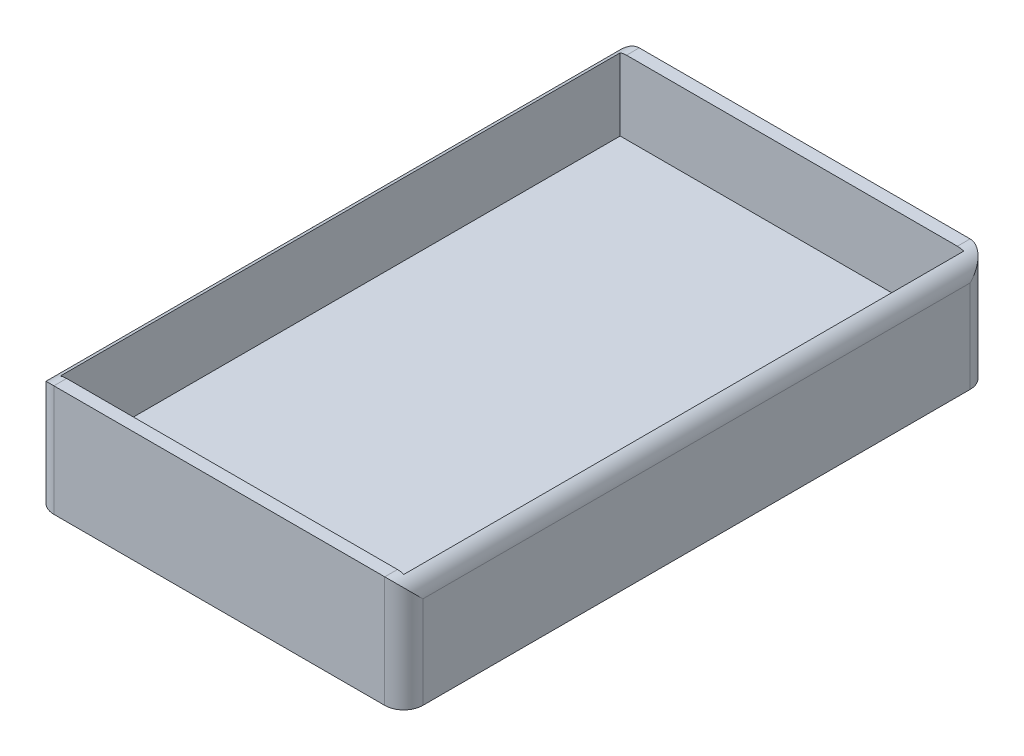
ISO-10303-21;
HEADER;
FILE_DESCRIPTION(('STEP AP214'),'2;1');
FILE_NAME('part.step','',(''),(''),'','','');
FILE_SCHEMA(('AUTOMOTIVE_DESIGN { 1 0 10303 214 1 1 1 1 }'));
ENDSEC;
DATA;
#1=APPLICATION_CONTEXT('core data for automotive mechanical design processes');
#2=APPLICATION_PROTOCOL_DEFINITION('international standard','automotive_design',2000,#1);
#3=PRODUCT_CONTEXT('',#1,'mechanical');
#4=PRODUCT('Part','Part','',(#3));
#5=PRODUCT_RELATED_PRODUCT_CATEGORY('part','',(#4));
#6=PRODUCT_DEFINITION_FORMATION('','',#4);
#7=PRODUCT_DEFINITION_CONTEXT('part definition',#1,'design');
#8=PRODUCT_DEFINITION('design','',#6,#7);
#9=PRODUCT_DEFINITION_SHAPE('','',#8);
#10=(LENGTH_UNIT() NAMED_UNIT(*) SI_UNIT(.MILLI.,.METRE.));
#11=(NAMED_UNIT(*) PLANE_ANGLE_UNIT() SI_UNIT($,.RADIAN.));
#12=(NAMED_UNIT(*) SI_UNIT($,.STERADIAN.) SOLID_ANGLE_UNIT());
#13=UNCERTAINTY_MEASURE_WITH_UNIT(LENGTH_MEASURE(1.E-05),#10,'distance_accuracy_value','');
#14=(GEOMETRIC_REPRESENTATION_CONTEXT(3) GLOBAL_UNCERTAINTY_ASSIGNED_CONTEXT((#13)) GLOBAL_UNIT_ASSIGNED_CONTEXT((#10,
#11,#12)) REPRESENTATION_CONTEXT('',''));
#15=CARTESIAN_POINT('',(0.,0.,0.));
#16=DIRECTION('',(0.,0.,1.));
#17=DIRECTION('',(1.,0.,0.));
#18=AXIS2_PLACEMENT_3D('',#15,#16,#17);
#19=CARTESIAN_POINT('',(0.,17.5,0.));
#20=DIRECTION('',(0.,-1.,0.));
#21=DIRECTION('',(0.,0.,-1.));
#22=AXIS2_PLACEMENT_3D('',#19,#20,#21);
#23=PLANE('',#22);
#24=DIRECTION('',(1.,0.,0.));
#25=VECTOR('',#24,1.);
#26=CARTESIAN_POINT('',(-29.,17.5,46.));
#27=LINE('',#26,#25);
#28=CARTESIAN_POINT('',(-26.,17.5,46.));
#29=VERTEX_POINT('',#28);
#30=CARTESIAN_POINT('',(26.,17.5,46.));
#31=VERTEX_POINT('',#30);
#32=EDGE_CURVE('E181',#29,#31,#27,.T.);
#33=ORIENTED_EDGE('',*,*,#32,.T.);
#34=DIRECTION('',(0.,0.,-1.));
#35=VECTOR('',#34,1.);
#36=CARTESIAN_POINT('',(26.,17.5,0.));
#37=LINE('',#36,#35);
#38=CARTESIAN_POINT('',(26.,17.5,44.));
#39=VERTEX_POINT('',#38);
#40=EDGE_CURVE('E219',#31,#39,#37,.T.);
#41=ORIENTED_EDGE('',*,*,#40,.T.);
#42=DIRECTION('',(1.,0.,0.));
#43=VECTOR('',#42,1.);
#44=CARTESIAN_POINT('',(-27.,17.5,44.));
#45=LINE('',#44,#43);
#46=CARTESIAN_POINT('',(-26.,17.5,44.));
#47=VERTEX_POINT('',#46);
#48=EDGE_CURVE('E160',#47,#39,#45,.T.);
#49=ORIENTED_EDGE('',*,*,#48,.F.);
#50=DIRECTION('',(0.,0.,1.));
#51=VECTOR('',#50,1.);
#52=CARTESIAN_POINT('',(-26.,17.5,0.));
#53=LINE('',#52,#51);
#54=EDGE_CURVE('E213',#47,#29,#53,.T.);
#55=ORIENTED_EDGE('',*,*,#54,.T.);
#56=EDGE_LOOP('',(#33,#41,#49,#55));
#57=FACE_BOUND('',#56,.T.);
#58=ADVANCED_FACE('F32',(#57),#23,.F.);
#59=CARTESIAN_POINT('',(29.,17.5,46.));
#60=DIRECTION('',(-1.,0.,0.));
#61=DIRECTION('',(0.,0.,1.));
#62=AXIS2_PLACEMENT_3D('',#59,#60,#61);
#63=PLANE('',#62);
#64=DIRECTION('',(0.,0.,-1.));
#65=VECTOR('',#64,1.);
#66=CARTESIAN_POINT('',(29.,0.,46.));
#67=LINE('',#66,#65);
#68=CARTESIAN_POINT('',(29.,0.,43.));
#69=VERTEX_POINT('',#68);
#70=CARTESIAN_POINT('',(29.,0.,-43.));
#71=VERTEX_POINT('',#70);
#72=EDGE_CURVE('E173',#69,#71,#67,.T.);
#73=ORIENTED_EDGE('',*,*,#72,.T.);
#74=DIRECTION('',(0.,-1.,0.));
#75=VECTOR('',#74,1.);
#76=CARTESIAN_POINT('',(29.,17.5,-43.));
#77=LINE('',#76,#75);
#78=CARTESIAN_POINT('',(29.,14.5,-43.));
#79=VERTEX_POINT('',#78);
#80=EDGE_CURVE('E211',#71,#79,#77,.F.);
#81=ORIENTED_EDGE('',*,*,#80,.T.);
#82=DIRECTION('',(0.,0.,-1.));
#83=VECTOR('',#82,1.);
#84=CARTESIAN_POINT('',(29.,14.5,46.));
#85=LINE('',#84,#83);
#86=CARTESIAN_POINT('',(29.,14.5,43.));
#87=VERTEX_POINT('',#86);
#88=EDGE_CURVE('E209',#79,#87,#85,.F.);
#89=ORIENTED_EDGE('',*,*,#88,.T.);
#90=DIRECTION('',(0.,-1.,0.));
#91=VECTOR('',#90,1.);
#92=CARTESIAN_POINT('',(29.,17.5,43.));
#93=LINE('',#92,#91);
#94=EDGE_CURVE('E207',#87,#69,#93,.T.);
#95=ORIENTED_EDGE('',*,*,#94,.T.);
#96=EDGE_LOOP('',(#73,#81,#89,#95));
#97=FACE_BOUND('',#96,.T.);
#98=ADVANCED_FACE('F297',(#97),#63,.F.);
#99=CARTESIAN_POINT('',(-29.,17.5,-46.));
#100=DIRECTION('',(0.,0.,1.));
#101=DIRECTION('',(1.,0.,0.));
#102=AXIS2_PLACEMENT_3D('',#99,#100,#101);
#103=PLANE('',#102);
#104=DIRECTION('',(-1.,0.,0.));
#105=VECTOR('',#104,1.);
#106=CARTESIAN_POINT('',(-29.,17.5,-46.));
#107=LINE('',#106,#105);
#108=CARTESIAN_POINT('',(26.,17.5,-46.));
#109=VERTEX_POINT('',#108);
#110=CARTESIAN_POINT('',(-26.,17.5,-46.));
#111=VERTEX_POINT('',#110);
#112=EDGE_CURVE('E178',#109,#111,#107,.T.);
#113=ORIENTED_EDGE('',*,*,#112,.F.);
#114=DIRECTION('',(0.,-1.,0.));
#115=VECTOR('',#114,1.);
#116=CARTESIAN_POINT('',(26.,17.5,-46.));
#117=LINE('',#116,#115);
#118=CARTESIAN_POINT('',(26.,0.,-46.));
#119=VERTEX_POINT('',#118);
#120=EDGE_CURVE('E196',#109,#119,#117,.T.);
#121=ORIENTED_EDGE('',*,*,#120,.T.);
#122=DIRECTION('',(-1.,0.,0.));
#123=VECTOR('',#122,1.);
#124=CARTESIAN_POINT('',(-29.,0.,-46.));
#125=LINE('',#124,#123);
#126=CARTESIAN_POINT('',(-26.,0.,-46.));
#127=VERTEX_POINT('',#126);
#128=EDGE_CURVE('E188',#119,#127,#125,.T.);
#129=ORIENTED_EDGE('',*,*,#128,.T.);
#130=DIRECTION('',(0.,-1.,0.));
#131=VECTOR('',#130,1.);
#132=CARTESIAN_POINT('',(-26.,17.5,-46.));
#133=LINE('',#132,#131);
#134=EDGE_CURVE('E185',#127,#111,#133,.F.);
#135=ORIENTED_EDGE('',*,*,#134,.T.);
#136=EDGE_LOOP('',(#113,#121,#129,#135));
#137=FACE_BOUND('',#136,.T.);
#138=ADVANCED_FACE('F302',(#137),#103,.F.);
#139=CARTESIAN_POINT('',(-29.,17.5,46.));
#140=DIRECTION('',(1.,0.,0.));
#141=DIRECTION('',(0.,0.,-1.));
#142=AXIS2_PLACEMENT_3D('',#139,#140,#141);
#143=PLANE('',#142);
#144=DIRECTION('',(0.,0.,1.));
#145=VECTOR('',#144,1.);
#146=CARTESIAN_POINT('',(-29.,14.5,46.));
#147=LINE('',#146,#145);
#148=CARTESIAN_POINT('',(-29.,14.5,43.));
#149=VERTEX_POINT('',#148);
#150=CARTESIAN_POINT('',(-29.,14.5,-43.));
#151=VERTEX_POINT('',#150);
#152=EDGE_CURVE('E49',#149,#151,#147,.F.);
#153=ORIENTED_EDGE('',*,*,#152,.T.);
#154=DIRECTION('',(0.,-1.,0.));
#155=VECTOR('',#154,1.);
#156=CARTESIAN_POINT('',(-29.,17.5,-43.));
#157=LINE('',#156,#155);
#158=CARTESIAN_POINT('',(-29.,0.,-43.));
#159=VERTEX_POINT('',#158);
#160=EDGE_CURVE('E41',#151,#159,#157,.T.);
#161=ORIENTED_EDGE('',*,*,#160,.T.);
#162=DIRECTION('',(0.,0.,1.));
#163=VECTOR('',#162,1.);
#164=CARTESIAN_POINT('',(-29.,0.,46.));
#165=LINE('',#164,#163);
#166=CARTESIAN_POINT('',(-29.,0.,43.));
#167=VERTEX_POINT('',#166);
#168=EDGE_CURVE('E191',#159,#167,#165,.T.);
#169=ORIENTED_EDGE('',*,*,#168,.T.);
#170=DIRECTION('',(0.,-1.,0.));
#171=VECTOR('',#170,1.);
#172=CARTESIAN_POINT('',(-29.,17.5,43.));
#173=LINE('',#172,#171);
#174=EDGE_CURVE('E54',#167,#149,#173,.F.);
#175=ORIENTED_EDGE('',*,*,#174,.T.);
#176=EDGE_LOOP('',(#153,#161,#169,#175));
#177=FACE_BOUND('',#176,.T.);
#178=ADVANCED_FACE('F312',(#177),#143,.F.);
#179=CARTESIAN_POINT('',(-29.,17.5,46.));
#180=DIRECTION('',(0.,0.,-1.));
#181=DIRECTION('',(-1.,0.,0.));
#182=AXIS2_PLACEMENT_3D('',#179,#180,#181);
#183=PLANE('',#182);
#184=DIRECTION('',(1.,0.,0.));
#185=VECTOR('',#184,1.);
#186=CARTESIAN_POINT('',(-29.,0.,46.));
#187=LINE('',#186,#185);
#188=CARTESIAN_POINT('',(-26.,0.,46.));
#189=VERTEX_POINT('',#188);
#190=CARTESIAN_POINT('',(26.,0.,46.));
#191=VERTEX_POINT('',#190);
#192=EDGE_CURVE('E182',#189,#191,#187,.T.);
#193=ORIENTED_EDGE('',*,*,#192,.T.);
#194=DIRECTION('',(0.,-1.,0.));
#195=VECTOR('',#194,1.);
#196=CARTESIAN_POINT('',(26.,17.5,46.));
#197=LINE('',#196,#195);
#198=EDGE_CURVE('E232',#191,#31,#197,.F.);
#199=ORIENTED_EDGE('',*,*,#198,.T.);
#200=ORIENTED_EDGE('',*,*,#32,.F.);
#201=DIRECTION('',(0.,-1.,0.));
#202=VECTOR('',#201,1.);
#203=CARTESIAN_POINT('',(-26.,17.5,46.));
#204=LINE('',#203,#202);
#205=EDGE_CURVE('E230',#29,#189,#204,.T.);
#206=ORIENTED_EDGE('',*,*,#205,.T.);
#207=EDGE_LOOP('',(#193,#199,#200,#206));
#208=FACE_BOUND('',#207,.T.);
#209=ADVANCED_FACE('F258',(#208),#183,.F.);
#210=DIRECTION('',(-1.,0.,0.));
#211=VECTOR('',#210,1.);
#212=CARTESIAN_POINT('',(-27.,17.5,-44.));
#213=LINE('',#212,#211);
#214=CARTESIAN_POINT('',(26.,17.5,-44.));
#215=VERTEX_POINT('',#214);
#216=CARTESIAN_POINT('',(-26.,17.5,-44.));
#217=VERTEX_POINT('',#216);
#218=EDGE_CURVE('E163',#215,#217,#213,.T.);
#219=ORIENTED_EDGE('',*,*,#218,.F.);
#220=DIRECTION('',(0.,0.,-1.));
#221=VECTOR('',#220,1.);
#222=CARTESIAN_POINT('',(26.,17.5,0.));
#223=LINE('',#222,#221);
#224=EDGE_CURVE('E217',#215,#109,#223,.T.);
#225=ORIENTED_EDGE('',*,*,#224,.T.);
#226=ORIENTED_EDGE('',*,*,#112,.T.);
#227=DIRECTION('',(0.,0.,1.));
#228=VECTOR('',#227,1.);
#229=CARTESIAN_POINT('',(-26.,17.5,0.));
#230=LINE('',#229,#228);
#231=EDGE_CURVE('E215',#111,#217,#230,.T.);
#232=ORIENTED_EDGE('',*,*,#231,.T.);
#233=EDGE_LOOP('',(#219,#225,#226,#232));
#234=FACE_BOUND('',#233,.T.);
#235=ADVANCED_FACE('F282',(#234),#23,.F.);
#236=CARTESIAN_POINT('',(0.,0.,0.));
#237=DIRECTION('',(0.,-1.,0.));
#238=DIRECTION('',(0.,0.,-1.));
#239=AXIS2_PLACEMENT_3D('',#236,#237,#238);
#240=PLANE('',#239);
#241=ORIENTED_EDGE('',*,*,#128,.F.);
#242=CARTESIAN_POINT('',(26.,0.,-43.));
#243=DIRECTION('',(0.,-1.,0.));
#244=DIRECTION('',(0.,0.,-1.));
#245=AXIS2_PLACEMENT_3D('',#242,#243,#244);
#246=CIRCLE('',#245,3.);
#247=EDGE_CURVE('E205',#119,#71,#246,.T.);
#248=ORIENTED_EDGE('',*,*,#247,.T.);
#249=ORIENTED_EDGE('',*,*,#72,.F.);
#250=CARTESIAN_POINT('',(26.,0.,43.));
#251=DIRECTION('',(0.,-1.,0.));
#252=DIRECTION('',(0.,0.,-1.));
#253=AXIS2_PLACEMENT_3D('',#250,#251,#252);
#254=CIRCLE('',#253,3.);
#255=EDGE_CURVE('E203',#69,#191,#254,.T.);
#256=ORIENTED_EDGE('',*,*,#255,.T.);
#257=ORIENTED_EDGE('',*,*,#192,.F.);
#258=CARTESIAN_POINT('',(-26.,0.,43.));
#259=DIRECTION('',(0.,-1.,0.));
#260=DIRECTION('',(0.,0.,-1.));
#261=AXIS2_PLACEMENT_3D('',#258,#259,#260);
#262=CIRCLE('',#261,3.);
#263=EDGE_CURVE('E199',#189,#167,#262,.T.);
#264=ORIENTED_EDGE('',*,*,#263,.T.);
#265=ORIENTED_EDGE('',*,*,#168,.F.);
#266=CARTESIAN_POINT('',(-26.,0.,-43.));
#267=DIRECTION('',(0.,-1.,0.));
#268=DIRECTION('',(0.,0.,-1.));
#269=AXIS2_PLACEMENT_3D('',#266,#267,#268);
#270=CIRCLE('',#269,3.);
#271=EDGE_CURVE('E201',#159,#127,#270,.T.);
#272=ORIENTED_EDGE('',*,*,#271,.T.);
#273=EDGE_LOOP('',(#241,#248,#249,#256,#257,#264,#265,#272));
#274=FACE_BOUND('',#273,.T.);
#275=ADVANCED_FACE('F262',(#274),#240,.T.);
#276=CARTESIAN_POINT('',(27.,6.,44.));
#277=DIRECTION('',(1.,0.,0.));
#278=DIRECTION('',(0.,0.,-1.));
#279=AXIS2_PLACEMENT_3D('',#276,#277,#278);
#280=PLANE('',#279);
#281=DIRECTION('',(0.,1.,0.));
#282=VECTOR('',#281,1.);
#283=CARTESIAN_POINT('',(27.,6.,44.));
#284=LINE('',#283,#282);
#285=CARTESIAN_POINT('',(27.,6.,44.));
#286=VERTEX_POINT('',#285);
#287=CARTESIAN_POINT('',(27.,17.3284271247462,44.));
#288=VERTEX_POINT('',#287);
#289=EDGE_CURVE('E171',#286,#288,#284,.T.);
#290=ORIENTED_EDGE('',*,*,#289,.T.);
#291=DIRECTION('',(0.,0.,-1.));
#292=VECTOR('',#291,1.);
#293=CARTESIAN_POINT('',(27.,17.3284271247462,44.));
#294=LINE('',#293,#292);
#295=CARTESIAN_POINT('',(27.,17.3284271247462,-44.));
#296=VERTEX_POINT('',#295);
#297=EDGE_CURVE('E143',#288,#296,#294,.T.);
#298=ORIENTED_EDGE('',*,*,#297,.T.);
#299=DIRECTION('',(0.,1.,0.));
#300=VECTOR('',#299,1.);
#301=CARTESIAN_POINT('',(27.,6.,-44.));
#302=LINE('',#301,#300);
#303=CARTESIAN_POINT('',(27.,6.,-44.));
#304=VERTEX_POINT('',#303);
#305=EDGE_CURVE('E135',#304,#296,#302,.T.);
#306=ORIENTED_EDGE('',*,*,#305,.F.);
#307=DIRECTION('',(0.,0.,-1.));
#308=VECTOR('',#307,1.);
#309=CARTESIAN_POINT('',(27.,6.,44.));
#310=LINE('',#309,#308);
#311=EDGE_CURVE('E140',#286,#304,#310,.T.);
#312=ORIENTED_EDGE('',*,*,#311,.F.);
#313=EDGE_LOOP('',(#290,#298,#306,#312));
#314=FACE_BOUND('',#313,.T.);
#315=ADVANCED_FACE('F138',(#314),#280,.F.);
#316=CARTESIAN_POINT('',(-27.,6.,44.));
#317=DIRECTION('',(0.,0.,1.));
#318=DIRECTION('',(1.,0.,0.));
#319=AXIS2_PLACEMENT_3D('',#316,#317,#318);
#320=PLANE('',#319);
#321=ORIENTED_EDGE('',*,*,#48,.T.);
#322=CARTESIAN_POINT('',(26.,14.5,44.));
#323=DIRECTION('',(0.,0.,1.));
#324=DIRECTION('',(1.,0.,0.));
#325=AXIS2_PLACEMENT_3D('',#322,#323,#324);
#326=CIRCLE('',#325,3.);
#327=EDGE_CURVE('E223',#39,#288,#326,.F.);
#328=ORIENTED_EDGE('',*,*,#327,.T.);
#329=ORIENTED_EDGE('',*,*,#289,.F.);
#330=DIRECTION('',(1.,0.,0.));
#331=VECTOR('',#330,1.);
#332=CARTESIAN_POINT('',(-27.,6.,44.));
#333=LINE('',#332,#331);
#334=CARTESIAN_POINT('',(-27.,6.,44.));
#335=VERTEX_POINT('',#334);
#336=EDGE_CURVE('E147',#335,#286,#333,.T.);
#337=ORIENTED_EDGE('',*,*,#336,.F.);
#338=DIRECTION('',(0.,1.,0.));
#339=VECTOR('',#338,1.);
#340=CARTESIAN_POINT('',(-27.,6.,44.));
#341=LINE('',#340,#339);
#342=CARTESIAN_POINT('',(-27.,17.3284271247462,44.));
#343=VERTEX_POINT('',#342);
#344=EDGE_CURVE('E174',#335,#343,#341,.T.);
#345=ORIENTED_EDGE('',*,*,#344,.T.);
#346=CARTESIAN_POINT('',(-26.,14.5,44.));
#347=DIRECTION('',(0.,0.,1.));
#348=DIRECTION('',(1.,0.,0.));
#349=AXIS2_PLACEMENT_3D('',#346,#347,#348);
#350=CIRCLE('',#349,3.);
#351=EDGE_CURVE('E221',#343,#47,#350,.F.);
#352=ORIENTED_EDGE('',*,*,#351,.T.);
#353=EDGE_LOOP('',(#321,#328,#329,#337,#345,#352));
#354=FACE_BOUND('',#353,.T.);
#355=ADVANCED_FACE('F275',(#354),#320,.F.);
#356=CARTESIAN_POINT('',(-27.,6.,44.));
#357=DIRECTION('',(-1.,0.,0.));
#358=DIRECTION('',(0.,0.,1.));
#359=AXIS2_PLACEMENT_3D('',#356,#357,#358);
#360=PLANE('',#359);
#361=DIRECTION('',(0.,1.,0.));
#362=VECTOR('',#361,1.);
#363=CARTESIAN_POINT('',(-27.,6.,-44.));
#364=LINE('',#363,#362);
#365=CARTESIAN_POINT('',(-27.,6.,-44.));
#366=VERTEX_POINT('',#365);
#367=CARTESIAN_POINT('',(-27.,17.3284271247462,-44.));
#368=VERTEX_POINT('',#367);
#369=EDGE_CURVE('E146',#366,#368,#364,.T.);
#370=ORIENTED_EDGE('',*,*,#369,.T.);
#371=DIRECTION('',(0.,0.,1.));
#372=VECTOR('',#371,1.);
#373=CARTESIAN_POINT('',(-27.,17.3284271247462,-44.));
#374=LINE('',#373,#372);
#375=EDGE_CURVE('E11',#368,#343,#374,.T.);
#376=ORIENTED_EDGE('',*,*,#375,.T.);
#377=ORIENTED_EDGE('',*,*,#344,.F.);
#378=DIRECTION('',(0.,0.,1.));
#379=VECTOR('',#378,1.);
#380=CARTESIAN_POINT('',(-27.,6.,44.));
#381=LINE('',#380,#379);
#382=EDGE_CURVE('E156',#366,#335,#381,.T.);
#383=ORIENTED_EDGE('',*,*,#382,.F.);
#384=EDGE_LOOP('',(#370,#376,#377,#383));
#385=FACE_BOUND('',#384,.T.);
#386=ADVANCED_FACE('F287',(#385),#360,.F.);
#387=CARTESIAN_POINT('',(-27.,6.,-44.));
#388=DIRECTION('',(0.,0.,-1.));
#389=DIRECTION('',(-1.,0.,0.));
#390=AXIS2_PLACEMENT_3D('',#387,#388,#389);
#391=PLANE('',#390);
#392=ORIENTED_EDGE('',*,*,#305,.T.);
#393=CARTESIAN_POINT('',(26.,14.5,-44.));
#394=DIRECTION('',(0.,0.,-1.));
#395=DIRECTION('',(-1.,0.,0.));
#396=AXIS2_PLACEMENT_3D('',#393,#394,#395);
#397=CIRCLE('',#396,3.);
#398=EDGE_CURVE('E228',#296,#215,#397,.F.);
#399=ORIENTED_EDGE('',*,*,#398,.T.);
#400=ORIENTED_EDGE('',*,*,#218,.T.);
#401=CARTESIAN_POINT('',(-26.,14.5,-44.));
#402=DIRECTION('',(0.,0.,-1.));
#403=DIRECTION('',(-1.,0.,0.));
#404=AXIS2_PLACEMENT_3D('',#401,#402,#403);
#405=CIRCLE('',#404,3.);
#406=EDGE_CURVE('E226',#217,#368,#405,.F.);
#407=ORIENTED_EDGE('',*,*,#406,.T.);
#408=ORIENTED_EDGE('',*,*,#369,.F.);
#409=DIRECTION('',(-1.,0.,0.));
#410=VECTOR('',#409,1.);
#411=CARTESIAN_POINT('',(-27.,6.,-44.));
#412=LINE('',#411,#410);
#413=EDGE_CURVE('E150',#304,#366,#412,.T.);
#414=ORIENTED_EDGE('',*,*,#413,.F.);
#415=EDGE_LOOP('',(#392,#399,#400,#407,#408,#414));
#416=FACE_BOUND('',#415,.T.);
#417=ADVANCED_FACE('F151',(#416),#391,.F.);
#418=CARTESIAN_POINT('',(0.,6.,0.));
#419=DIRECTION('',(0.,-1.,0.));
#420=DIRECTION('',(0.,0.,-1.));
#421=AXIS2_PLACEMENT_3D('',#418,#419,#420);
#422=PLANE('',#421);
#423=ORIENTED_EDGE('',*,*,#311,.T.);
#424=ORIENTED_EDGE('',*,*,#413,.T.);
#425=ORIENTED_EDGE('',*,*,#382,.T.);
#426=ORIENTED_EDGE('',*,*,#336,.T.);
#427=EDGE_LOOP('',(#423,#424,#425,#426));
#428=FACE_BOUND('',#427,.T.);
#429=ADVANCED_FACE('F158',(#428),#422,.F.);
#430=CARTESIAN_POINT('',(26.,17.5,43.));
#431=DIRECTION('',(0.,-1.,0.));
#432=DIRECTION('',(0.,0.,-1.));
#433=AXIS2_PLACEMENT_3D('',#430,#431,#432);
#434=CYLINDRICAL_SURFACE('',#433,3.);
#435=ORIENTED_EDGE('',*,*,#255,.F.);
#436=ORIENTED_EDGE('',*,*,#94,.F.);
#437=CARTESIAN_POINT('',(26.,14.5,43.));
#438=DIRECTION('',(0.,-0.707106781186547,0.707106781186547));
#439=DIRECTION('',(0.,-0.707106781186547,-0.707106781186547));
#440=AXIS2_PLACEMENT_3D('',#437,#438,#439);
#441=ELLIPSE('',#440,4.24264068711928,3.);
#442=EDGE_CURVE('E169',#31,#87,#441,.F.);
#443=ORIENTED_EDGE('',*,*,#442,.F.);
#444=ORIENTED_EDGE('',*,*,#198,.F.);
#445=EDGE_LOOP('',(#435,#436,#443,#444));
#446=FACE_BOUND('',#445,.T.);
#447=ADVANCED_FACE('F268',(#446),#434,.T.);
#448=CARTESIAN_POINT('',(26.,14.5,0.));
#449=DIRECTION('',(0.,0.,-1.));
#450=DIRECTION('',(-1.,0.,0.));
#451=AXIS2_PLACEMENT_3D('',#448,#449,#450);
#452=CYLINDRICAL_SURFACE('',#451,3.);
#453=ORIENTED_EDGE('',*,*,#442,.T.);
#454=ORIENTED_EDGE('',*,*,#88,.F.);
#455=CARTESIAN_POINT('',(26.,14.5,-43.));
#456=DIRECTION('',(0.,-0.707106781186547,-0.707106781186547));
#457=DIRECTION('',(0.,0.707106781186547,-0.707106781186547));
#458=AXIS2_PLACEMENT_3D('',#455,#456,#457);
#459=ELLIPSE('',#458,4.24264068711928,3.);
#460=EDGE_CURVE('E237',#109,#79,#459,.T.);
#461=ORIENTED_EDGE('',*,*,#460,.F.);
#462=ORIENTED_EDGE('',*,*,#224,.F.);
#463=ORIENTED_EDGE('',*,*,#398,.F.);
#464=ORIENTED_EDGE('',*,*,#297,.F.);
#465=ORIENTED_EDGE('',*,*,#327,.F.);
#466=ORIENTED_EDGE('',*,*,#40,.F.);
#467=EDGE_LOOP('',(#453,#454,#461,#462,#463,#464,#465,#466));
#468=FACE_BOUND('',#467,.T.);
#469=ADVANCED_FACE('F277',(#468),#452,.T.);
#470=CARTESIAN_POINT('',(26.,17.5,-43.));
#471=DIRECTION('',(0.,-1.,0.));
#472=DIRECTION('',(0.,0.,-1.));
#473=AXIS2_PLACEMENT_3D('',#470,#471,#472);
#474=CYLINDRICAL_SURFACE('',#473,3.);
#475=ORIENTED_EDGE('',*,*,#460,.T.);
#476=ORIENTED_EDGE('',*,*,#80,.F.);
#477=ORIENTED_EDGE('',*,*,#247,.F.);
#478=ORIENTED_EDGE('',*,*,#120,.F.);
#479=EDGE_LOOP('',(#475,#476,#477,#478));
#480=FACE_BOUND('',#479,.T.);
#481=ADVANCED_FACE('F322',(#480),#474,.T.);
#482=CARTESIAN_POINT('',(-26.,17.5,43.));
#483=DIRECTION('',(0.,-1.,0.));
#484=DIRECTION('',(0.,0.,-1.));
#485=AXIS2_PLACEMENT_3D('',#482,#483,#484);
#486=CYLINDRICAL_SURFACE('',#485,3.);
#487=ORIENTED_EDGE('',*,*,#263,.F.);
#488=ORIENTED_EDGE('',*,*,#205,.F.);
#489=CARTESIAN_POINT('',(-26.,14.5,43.));
#490=DIRECTION('',(0.,-0.707106781186547,0.707106781186547));
#491=DIRECTION('',(0.,0.707106781186547,0.707106781186547));
#492=AXIS2_PLACEMENT_3D('',#489,#490,#491);
#493=ELLIPSE('',#492,4.24264068711928,3.);
#494=EDGE_CURVE('E36',#149,#29,#493,.F.);
#495=ORIENTED_EDGE('',*,*,#494,.F.);
#496=ORIENTED_EDGE('',*,*,#174,.F.);
#497=EDGE_LOOP('',(#487,#488,#495,#496));
#498=FACE_BOUND('',#497,.T.);
#499=ADVANCED_FACE('F34',(#498),#486,.T.);
#500=CARTESIAN_POINT('',(-26.,14.5,0.));
#501=DIRECTION('',(0.,0.,1.));
#502=DIRECTION('',(1.,0.,0.));
#503=AXIS2_PLACEMENT_3D('',#500,#501,#502);
#504=CYLINDRICAL_SURFACE('',#503,3.);
#505=ORIENTED_EDGE('',*,*,#406,.F.);
#506=ORIENTED_EDGE('',*,*,#231,.F.);
#507=CARTESIAN_POINT('',(-26.,14.5,-43.));
#508=DIRECTION('',(0.,0.707106781186547,0.707106781186547));
#509=DIRECTION('',(0.,-0.707106781186547,0.707106781186547));
#510=AXIS2_PLACEMENT_3D('',#507,#508,#509);
#511=ELLIPSE('',#510,4.24264068711928,3.);
#512=EDGE_CURVE('E241',#151,#111,#511,.F.);
#513=ORIENTED_EDGE('',*,*,#512,.F.);
#514=ORIENTED_EDGE('',*,*,#152,.F.);
#515=ORIENTED_EDGE('',*,*,#494,.T.);
#516=ORIENTED_EDGE('',*,*,#54,.F.);
#517=ORIENTED_EDGE('',*,*,#351,.F.);
#518=ORIENTED_EDGE('',*,*,#375,.F.);
#519=EDGE_LOOP('',(#505,#506,#513,#514,#515,#516,#517,#518));
#520=FACE_BOUND('',#519,.T.);
#521=ADVANCED_FACE('F250',(#520),#504,.T.);
#522=CARTESIAN_POINT('',(-26.,17.5,-43.));
#523=DIRECTION('',(0.,-1.,0.));
#524=DIRECTION('',(0.,0.,-1.));
#525=AXIS2_PLACEMENT_3D('',#522,#523,#524);
#526=CYLINDRICAL_SURFACE('',#525,3.);
#527=ORIENTED_EDGE('',*,*,#512,.T.);
#528=ORIENTED_EDGE('',*,*,#134,.F.);
#529=ORIENTED_EDGE('',*,*,#271,.F.);
#530=ORIENTED_EDGE('',*,*,#160,.F.);
#531=EDGE_LOOP('',(#527,#528,#529,#530));
#532=FACE_BOUND('',#531,.T.);
#533=ADVANCED_FACE('F330',(#532),#526,.T.);
#534=CLOSED_SHELL('',(#58,#98,#138,#178,#209,#235,#275,#315,#355,#386,#417,#429,#447,#469,#481,
#499,#521,#533));
#535=MANIFOLD_SOLID_BREP('B2',#534);
#536=ADVANCED_BREP_SHAPE_REPRESENTATION('',(#18,#535),#14);
#537=SHAPE_DEFINITION_REPRESENTATION(#9,#536);
ENDSEC;
END-ISO-10303-21;
